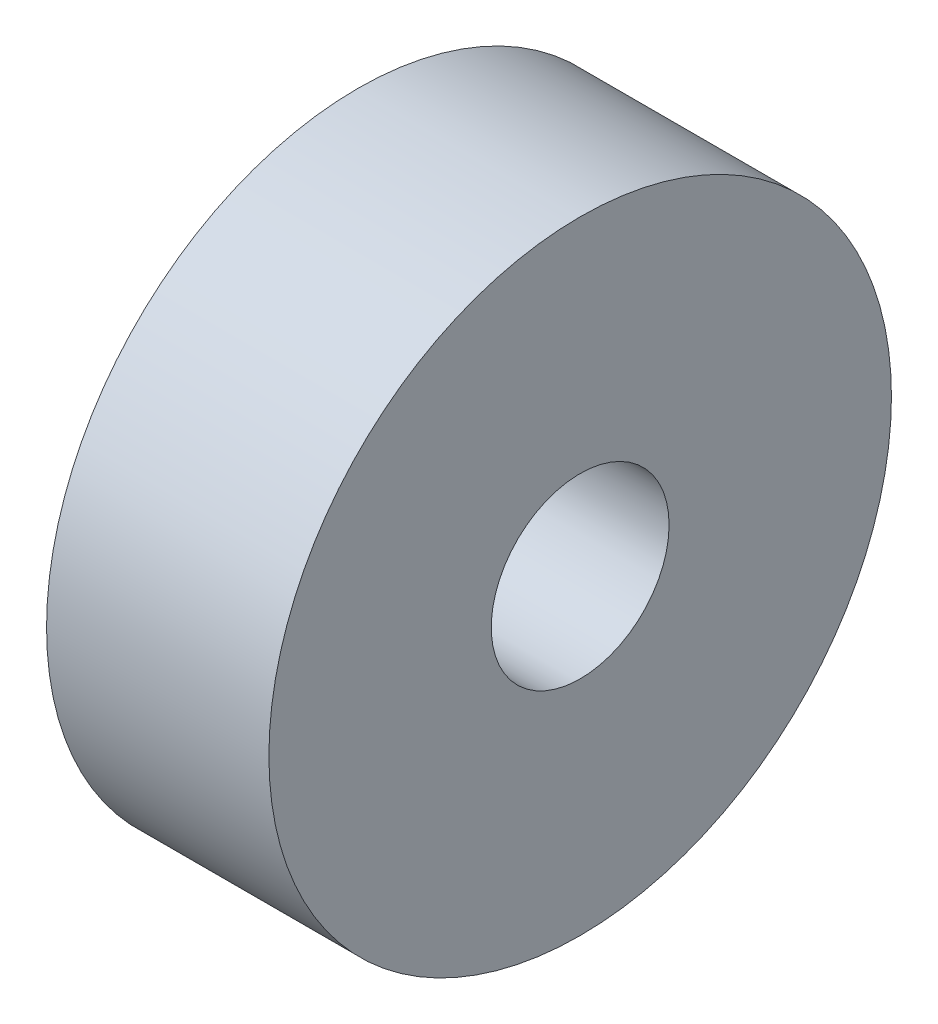
ISO-10303-21;
HEADER;
FILE_DESCRIPTION(('STEP AP214'),'2;1');
FILE_NAME('part.step','',(''),(''),'','','');
FILE_SCHEMA(('AUTOMOTIVE_DESIGN { 1 0 10303 214 1 1 1 1 }'));
ENDSEC;
DATA;
#1=APPLICATION_CONTEXT('core data for automotive mechanical design processes');
#2=APPLICATION_PROTOCOL_DEFINITION('international standard','automotive_design',2000,#1);
#3=PRODUCT_CONTEXT('',#1,'mechanical');
#4=PRODUCT('Part','Part','',(#3));
#5=PRODUCT_RELATED_PRODUCT_CATEGORY('part','',(#4));
#6=PRODUCT_DEFINITION_FORMATION('','',#4);
#7=PRODUCT_DEFINITION_CONTEXT('part definition',#1,'design');
#8=PRODUCT_DEFINITION('design','',#6,#7);
#9=PRODUCT_DEFINITION_SHAPE('','',#8);
#10=(LENGTH_UNIT() NAMED_UNIT(*) SI_UNIT(.MILLI.,.METRE.));
#11=(NAMED_UNIT(*) PLANE_ANGLE_UNIT() SI_UNIT($,.RADIAN.));
#12=(NAMED_UNIT(*) SI_UNIT($,.STERADIAN.) SOLID_ANGLE_UNIT());
#13=UNCERTAINTY_MEASURE_WITH_UNIT(LENGTH_MEASURE(1.E-05),#10,'distance_accuracy_value','');
#14=(GEOMETRIC_REPRESENTATION_CONTEXT(3) GLOBAL_UNCERTAINTY_ASSIGNED_CONTEXT((#13)) GLOBAL_UNIT_ASSIGNED_CONTEXT((#10,
#11,#12)) REPRESENTATION_CONTEXT('',''));
#15=CARTESIAN_POINT('',(0.,0.,0.));
#16=DIRECTION('',(0.,0.,1.));
#17=DIRECTION('',(1.,0.,0.));
#18=AXIS2_PLACEMENT_3D('',#15,#16,#17);
#19=CARTESIAN_POINT('',(125.,0.,0.));
#20=DIRECTION('',(1.,0.,0.));
#21=DIRECTION('',(0.,0.,-1.));
#22=AXIS2_PLACEMENT_3D('',#19,#20,#21);
#23=PLANE('',#22);
#24=CARTESIAN_POINT('',(125.,0.,0.));
#25=DIRECTION('',(1.,0.,0.));
#26=DIRECTION('',(0.,0.,-1.));
#27=AXIS2_PLACEMENT_3D('',#24,#25,#26);
#28=CIRCLE('',#27,350.);
#29=CARTESIAN_POINT('',(125.,0.,-350.));
#30=VERTEX_POINT('',#29);
#31=EDGE_CURVE('E10',#30,#30,#28,.T.);
#32=ORIENTED_EDGE('',*,*,#31,.T.);
#33=EDGE_LOOP('',(#32));
#34=FACE_BOUND('',#33,.T.);
#35=CARTESIAN_POINT('',(125.,0.,0.));
#36=DIRECTION('',(1.,0.,0.));
#37=DIRECTION('',(0.,0.,-1.));
#38=AXIS2_PLACEMENT_3D('',#35,#36,#37);
#39=CIRCLE('',#38,100.);
#40=CARTESIAN_POINT('',(125.,0.,-100.));
#41=VERTEX_POINT('',#40);
#42=EDGE_CURVE('E41',#41,#41,#39,.T.);
#43=ORIENTED_EDGE('',*,*,#42,.F.);
#44=EDGE_LOOP('',(#43));
#45=FACE_BOUND('',#44,.T.);
#46=ADVANCED_FACE('F30',(#34,#45),#23,.T.);
#47=CARTESIAN_POINT('',(-125.,0.,0.));
#48=DIRECTION('',(1.,0.,0.));
#49=DIRECTION('',(0.,0.,-1.));
#50=AXIS2_PLACEMENT_3D('',#47,#48,#49);
#51=PLANE('',#50);
#52=CARTESIAN_POINT('',(-125.,0.,0.));
#53=DIRECTION('',(1.,0.,0.));
#54=DIRECTION('',(0.,0.,-1.));
#55=AXIS2_PLACEMENT_3D('',#52,#53,#54);
#56=CIRCLE('',#55,350.);
#57=CARTESIAN_POINT('',(-125.,0.,-350.));
#58=VERTEX_POINT('',#57);
#59=EDGE_CURVE('E34',#58,#58,#56,.T.);
#60=ORIENTED_EDGE('',*,*,#59,.F.);
#61=EDGE_LOOP('',(#60));
#62=FACE_BOUND('',#61,.T.);
#63=CARTESIAN_POINT('',(-125.,0.,0.));
#64=DIRECTION('',(1.,0.,0.));
#65=DIRECTION('',(0.,0.,-1.));
#66=AXIS2_PLACEMENT_3D('',#63,#64,#65);
#67=CIRCLE('',#66,100.);
#68=CARTESIAN_POINT('',(-125.,0.,-100.));
#69=VERTEX_POINT('',#68);
#70=EDGE_CURVE('E43',#69,#69,#67,.T.);
#71=ORIENTED_EDGE('',*,*,#70,.T.);
#72=EDGE_LOOP('',(#71));
#73=FACE_BOUND('',#72,.T.);
#74=ADVANCED_FACE('F53',(#62,#73),#51,.F.);
#75=CARTESIAN_POINT('',(125.,0.,0.));
#76=DIRECTION('',(-1.,0.,0.));
#77=DIRECTION('',(0.,0.,1.));
#78=AXIS2_PLACEMENT_3D('',#75,#76,#77);
#79=CYLINDRICAL_SURFACE('',#78,350.);
#80=ORIENTED_EDGE('',*,*,#31,.F.);
#81=EDGE_LOOP('',(#80));
#82=FACE_BOUND('',#81,.T.);
#83=ORIENTED_EDGE('',*,*,#59,.T.);
#84=EDGE_LOOP('',(#83));
#85=FACE_BOUND('',#84,.T.);
#86=ADVANCED_FACE('F32',(#82,#85),#79,.T.);
#87=CARTESIAN_POINT('',(125.,0.,0.));
#88=DIRECTION('',(-1.,0.,0.));
#89=DIRECTION('',(0.,0.,1.));
#90=AXIS2_PLACEMENT_3D('',#87,#88,#89);
#91=CYLINDRICAL_SURFACE('',#90,100.);
#92=ORIENTED_EDGE('',*,*,#42,.T.);
#93=EDGE_LOOP('',(#92));
#94=FACE_BOUND('',#93,.T.);
#95=ORIENTED_EDGE('',*,*,#70,.F.);
#96=EDGE_LOOP('',(#95));
#97=FACE_BOUND('',#96,.T.);
#98=ADVANCED_FACE('F49',(#94,#97),#91,.F.);
#99=CLOSED_SHELL('',(#46,#74,#86,#98));
#100=MANIFOLD_SOLID_BREP('B2',#99);
#101=ADVANCED_BREP_SHAPE_REPRESENTATION('',(#18,#100),#14);
#102=SHAPE_DEFINITION_REPRESENTATION(#9,#101);
ENDSEC;
END-ISO-10303-21;
